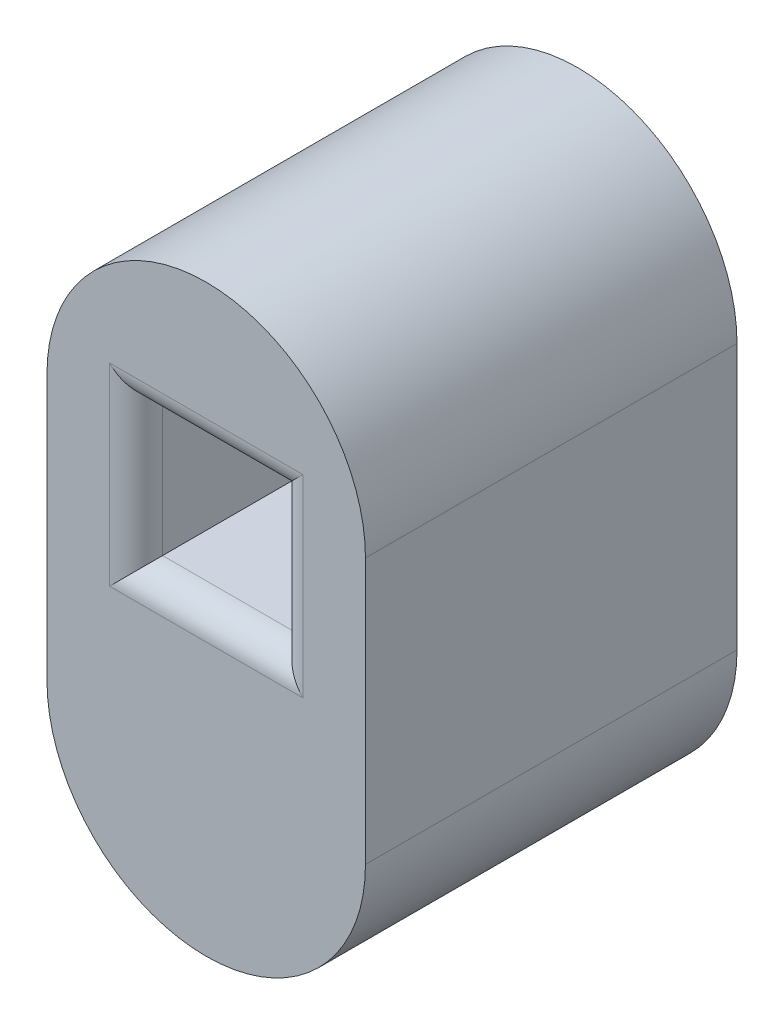
ISO-10303-21;
HEADER;
FILE_DESCRIPTION(('STEP AP214'),'2;1');
FILE_NAME('part.step','',(''),(''),'','','');
FILE_SCHEMA(('AUTOMOTIVE_DESIGN { 1 0 10303 214 1 1 1 1 }'));
ENDSEC;
DATA;
#1=APPLICATION_CONTEXT('core data for automotive mechanical design processes');
#2=APPLICATION_PROTOCOL_DEFINITION('international standard','automotive_design',2000,#1);
#3=PRODUCT_CONTEXT('',#1,'mechanical');
#4=PRODUCT('Part','Part','',(#3));
#5=PRODUCT_RELATED_PRODUCT_CATEGORY('part','',(#4));
#6=PRODUCT_DEFINITION_FORMATION('','',#4);
#7=PRODUCT_DEFINITION_CONTEXT('part definition',#1,'design');
#8=PRODUCT_DEFINITION('design','',#6,#7);
#9=PRODUCT_DEFINITION_SHAPE('','',#8);
#10=(LENGTH_UNIT() NAMED_UNIT(*) SI_UNIT(.MILLI.,.METRE.));
#11=(NAMED_UNIT(*) PLANE_ANGLE_UNIT() SI_UNIT($,.RADIAN.));
#12=(NAMED_UNIT(*) SI_UNIT($,.STERADIAN.) SOLID_ANGLE_UNIT());
#13=UNCERTAINTY_MEASURE_WITH_UNIT(LENGTH_MEASURE(1.E-05),#10,'distance_accuracy_value','');
#14=(GEOMETRIC_REPRESENTATION_CONTEXT(3) GLOBAL_UNCERTAINTY_ASSIGNED_CONTEXT((#13)) GLOBAL_UNIT_ASSIGNED_CONTEXT((#10,
#11,#12)) REPRESENTATION_CONTEXT('',''));
#15=CARTESIAN_POINT('',(0.,0.,0.));
#16=DIRECTION('',(0.,0.,1.));
#17=DIRECTION('',(1.,0.,0.));
#18=AXIS2_PLACEMENT_3D('',#15,#16,#17);
#19=CARTESIAN_POINT('',(0.,0.,14.));
#20=DIRECTION('',(0.,0.,1.));
#21=DIRECTION('',(1.,0.,0.));
#22=AXIS2_PLACEMENT_3D('',#19,#20,#21);
#23=PLANE('',#22);
#24=DIRECTION('',(0.,1.,0.));
#25=VECTOR('',#24,1.);
#26=CARTESIAN_POINT('',(3.644,0.,14.));
#27=LINE('',#26,#25);
#28=CARTESIAN_POINT('',(3.644,11.544,14.));
#29=VERTEX_POINT('',#28);
#30=CARTESIAN_POINT('',(3.644,4.256,14.));
#31=VERTEX_POINT('',#30);
#32=EDGE_CURVE('E157',#29,#31,#27,.F.);
#33=ORIENTED_EDGE('',*,*,#32,.T.);
#34=DIRECTION('',(1.,0.,0.));
#35=VECTOR('',#34,1.);
#36=CARTESIAN_POINT('',(0.,4.256,14.));
#37=LINE('',#36,#35);
#38=CARTESIAN_POINT('',(-3.644,4.256,14.));
#39=VERTEX_POINT('',#38);
#40=EDGE_CURVE('E168',#31,#39,#37,.F.);
#41=ORIENTED_EDGE('',*,*,#40,.T.);
#42=DIRECTION('',(0.,-1.,0.));
#43=VECTOR('',#42,1.);
#44=CARTESIAN_POINT('',(-3.644,0.,14.));
#45=LINE('',#44,#43);
#46=CARTESIAN_POINT('',(-3.644,11.544,14.));
#47=VERTEX_POINT('',#46);
#48=EDGE_CURVE('E166',#39,#47,#45,.F.);
#49=ORIENTED_EDGE('',*,*,#48,.T.);
#50=DIRECTION('',(-1.,0.,0.));
#51=VECTOR('',#50,1.);
#52=CARTESIAN_POINT('',(0.,11.544,14.));
#53=LINE('',#52,#51);
#54=EDGE_CURVE('E164',#47,#29,#53,.F.);
#55=ORIENTED_EDGE('',*,*,#54,.T.);
#56=EDGE_LOOP('',(#33,#41,#49,#55));
#57=FACE_BOUND('',#56,.T.);
#58=CARTESIAN_POINT('',(0.,0.,14.));
#59=DIRECTION('',(0.,0.,1.));
#60=DIRECTION('',(1.,0.,0.));
#61=AXIS2_PLACEMENT_3D('',#58,#59,#60);
#62=CIRCLE('',#61,6.);
#63=CARTESIAN_POINT('',(-6.,0.,14.));
#64=VERTEX_POINT('',#63);
#65=CARTESIAN_POINT('',(6.,0.,14.));
#66=VERTEX_POINT('',#65);
#67=EDGE_CURVE('E141',#64,#66,#62,.T.);
#68=ORIENTED_EDGE('',*,*,#67,.T.);
#69=DIRECTION('',(0.,1.,0.));
#70=VECTOR('',#69,1.);
#71=CARTESIAN_POINT('',(6.,0.,14.));
#72=LINE('',#71,#70);
#73=CARTESIAN_POINT('',(6.,10.,14.));
#74=VERTEX_POINT('',#73);
#75=EDGE_CURVE('E130',#66,#74,#72,.T.);
#76=ORIENTED_EDGE('',*,*,#75,.T.);
#77=CARTESIAN_POINT('',(0.,10.,14.));
#78=DIRECTION('',(0.,0.,1.));
#79=DIRECTION('',(1.,0.,0.));
#80=AXIS2_PLACEMENT_3D('',#77,#78,#79);
#81=CIRCLE('',#80,6.);
#82=CARTESIAN_POINT('',(-6.,10.,14.));
#83=VERTEX_POINT('',#82);
#84=EDGE_CURVE('E140',#74,#83,#81,.T.);
#85=ORIENTED_EDGE('',*,*,#84,.T.);
#86=DIRECTION('',(0.,-1.,0.));
#87=VECTOR('',#86,1.);
#88=CARTESIAN_POINT('',(-6.,0.,14.));
#89=LINE('',#88,#87);
#90=EDGE_CURVE('E145',#83,#64,#89,.T.);
#91=ORIENTED_EDGE('',*,*,#90,.T.);
#92=EDGE_LOOP('',(#68,#76,#85,#91));
#93=FACE_BOUND('',#92,.T.);
#94=ADVANCED_FACE('F39',(#57,#93),#23,.T.);
#95=CARTESIAN_POINT('',(0.,0.,0.));
#96=DIRECTION('',(0.,0.,1.));
#97=DIRECTION('',(1.,0.,0.));
#98=AXIS2_PLACEMENT_3D('',#95,#96,#97);
#99=PLANE('',#98);
#100=DIRECTION('',(-1.,0.,0.));
#101=VECTOR('',#100,1.);
#102=CARTESIAN_POINT('',(-2.644,11.544,0.));
#103=LINE('',#102,#101);
#104=CARTESIAN_POINT('',(3.644,11.544,0.));
#105=VERTEX_POINT('',#104);
#106=CARTESIAN_POINT('',(-3.644,11.544,0.));
#107=VERTEX_POINT('',#106);
#108=EDGE_CURVE('E177',#105,#107,#103,.T.);
#109=ORIENTED_EDGE('',*,*,#108,.T.);
#110=DIRECTION('',(0.,-1.,0.));
#111=VECTOR('',#110,1.);
#112=CARTESIAN_POINT('',(-3.644,5.256,0.));
#113=LINE('',#112,#111);
#114=CARTESIAN_POINT('',(-3.644,4.256,0.));
#115=VERTEX_POINT('',#114);
#116=EDGE_CURVE('E194',#107,#115,#113,.T.);
#117=ORIENTED_EDGE('',*,*,#116,.T.);
#118=DIRECTION('',(1.,0.,0.));
#119=VECTOR('',#118,1.);
#120=CARTESIAN_POINT('',(2.644,4.256,0.));
#121=LINE('',#120,#119);
#122=CARTESIAN_POINT('',(3.644,4.256,0.));
#123=VERTEX_POINT('',#122);
#124=EDGE_CURVE('E192',#115,#123,#121,.T.);
#125=ORIENTED_EDGE('',*,*,#124,.T.);
#126=DIRECTION('',(0.,1.,0.));
#127=VECTOR('',#126,1.);
#128=CARTESIAN_POINT('',(3.644,10.544,0.));
#129=LINE('',#128,#127);
#130=EDGE_CURVE('E190',#123,#105,#129,.T.);
#131=ORIENTED_EDGE('',*,*,#130,.T.);
#132=EDGE_LOOP('',(#109,#117,#125,#131));
#133=FACE_BOUND('',#132,.T.);
#134=CARTESIAN_POINT('',(0.,0.,0.));
#135=DIRECTION('',(0.,0.,1.));
#136=DIRECTION('',(1.,0.,0.));
#137=AXIS2_PLACEMENT_3D('',#134,#135,#136);
#138=CIRCLE('',#137,6.);
#139=CARTESIAN_POINT('',(-6.,0.,0.));
#140=VERTEX_POINT('',#139);
#141=CARTESIAN_POINT('',(6.,0.,0.));
#142=VERTEX_POINT('',#141);
#143=EDGE_CURVE('E153',#140,#142,#138,.T.);
#144=ORIENTED_EDGE('',*,*,#143,.F.);
#145=DIRECTION('',(0.,-1.,0.));
#146=VECTOR('',#145,1.);
#147=CARTESIAN_POINT('',(-6.,0.,0.));
#148=LINE('',#147,#146);
#149=CARTESIAN_POINT('',(-6.,10.,0.));
#150=VERTEX_POINT('',#149);
#151=EDGE_CURVE('E149',#150,#140,#148,.T.);
#152=ORIENTED_EDGE('',*,*,#151,.F.);
#153=CARTESIAN_POINT('',(0.,10.,0.));
#154=DIRECTION('',(0.,0.,1.));
#155=DIRECTION('',(1.,0.,0.));
#156=AXIS2_PLACEMENT_3D('',#153,#154,#155);
#157=CIRCLE('',#156,6.);
#158=CARTESIAN_POINT('',(6.,10.,0.));
#159=VERTEX_POINT('',#158);
#160=EDGE_CURVE('E248',#159,#150,#157,.T.);
#161=ORIENTED_EDGE('',*,*,#160,.F.);
#162=DIRECTION('',(0.,1.,0.));
#163=VECTOR('',#162,1.);
#164=CARTESIAN_POINT('',(6.,0.,0.));
#165=LINE('',#164,#163);
#166=EDGE_CURVE('E245',#142,#159,#165,.T.);
#167=ORIENTED_EDGE('',*,*,#166,.F.);
#168=EDGE_LOOP('',(#144,#152,#161,#167));
#169=FACE_BOUND('',#168,.T.);
#170=ADVANCED_FACE('F239',(#133,#169),#99,.F.);
#171=CARTESIAN_POINT('',(0.,0.,14.));
#172=DIRECTION('',(0.,0.,-1.));
#173=DIRECTION('',(-1.,0.,0.));
#174=AXIS2_PLACEMENT_3D('',#171,#172,#173);
#175=CYLINDRICAL_SURFACE('',#174,6.);
#176=ORIENTED_EDGE('',*,*,#143,.T.);
#177=DIRECTION('',(0.,0.,-1.));
#178=VECTOR('',#177,1.);
#179=CARTESIAN_POINT('',(6.,0.,14.));
#180=LINE('',#179,#178);
#181=EDGE_CURVE('E134',#66,#142,#180,.T.);
#182=ORIENTED_EDGE('',*,*,#181,.F.);
#183=ORIENTED_EDGE('',*,*,#67,.F.);
#184=DIRECTION('',(0.,0.,-1.));
#185=VECTOR('',#184,1.);
#186=CARTESIAN_POINT('',(-6.,0.,14.));
#187=LINE('',#186,#185);
#188=EDGE_CURVE('E256',#64,#140,#187,.T.);
#189=ORIENTED_EDGE('',*,*,#188,.T.);
#190=EDGE_LOOP('',(#176,#182,#183,#189));
#191=FACE_BOUND('',#190,.T.);
#192=ADVANCED_FACE('F151',(#191),#175,.T.);
#193=CARTESIAN_POINT('',(6.,0.,14.));
#194=DIRECTION('',(-1.,0.,0.));
#195=DIRECTION('',(0.,0.,1.));
#196=AXIS2_PLACEMENT_3D('',#193,#194,#195);
#197=PLANE('',#196);
#198=ORIENTED_EDGE('',*,*,#166,.T.);
#199=DIRECTION('',(0.,0.,-1.));
#200=VECTOR('',#199,1.);
#201=CARTESIAN_POINT('',(6.,10.,14.));
#202=LINE('',#201,#200);
#203=EDGE_CURVE('E137',#74,#159,#202,.T.);
#204=ORIENTED_EDGE('',*,*,#203,.F.);
#205=ORIENTED_EDGE('',*,*,#75,.F.);
#206=ORIENTED_EDGE('',*,*,#181,.T.);
#207=EDGE_LOOP('',(#198,#204,#205,#206));
#208=FACE_BOUND('',#207,.T.);
#209=ADVANCED_FACE('F132',(#208),#197,.F.);
#210=CARTESIAN_POINT('',(0.,10.,14.));
#211=DIRECTION('',(0.,0.,-1.));
#212=DIRECTION('',(-1.,0.,0.));
#213=AXIS2_PLACEMENT_3D('',#210,#211,#212);
#214=CYLINDRICAL_SURFACE('',#213,6.);
#215=ORIENTED_EDGE('',*,*,#160,.T.);
#216=DIRECTION('',(0.,0.,-1.));
#217=VECTOR('',#216,1.);
#218=CARTESIAN_POINT('',(-6.,10.,14.));
#219=LINE('',#218,#217);
#220=EDGE_CURVE('E159',#83,#150,#219,.T.);
#221=ORIENTED_EDGE('',*,*,#220,.F.);
#222=ORIENTED_EDGE('',*,*,#84,.F.);
#223=ORIENTED_EDGE('',*,*,#203,.T.);
#224=EDGE_LOOP('',(#215,#221,#222,#223));
#225=FACE_BOUND('',#224,.T.);
#226=ADVANCED_FACE('F262',(#225),#214,.T.);
#227=CARTESIAN_POINT('',(-6.,0.,14.));
#228=DIRECTION('',(1.,0.,0.));
#229=DIRECTION('',(0.,0.,-1.));
#230=AXIS2_PLACEMENT_3D('',#227,#228,#229);
#231=PLANE('',#230);
#232=ORIENTED_EDGE('',*,*,#151,.T.);
#233=ORIENTED_EDGE('',*,*,#188,.F.);
#234=ORIENTED_EDGE('',*,*,#90,.F.);
#235=ORIENTED_EDGE('',*,*,#220,.T.);
#236=EDGE_LOOP('',(#232,#233,#234,#235));
#237=FACE_BOUND('',#236,.T.);
#238=ADVANCED_FACE('F260',(#237),#231,.F.);
#239=CARTESIAN_POINT('',(2.644,5.256,14.));
#240=DIRECTION('',(-1.,0.,0.));
#241=DIRECTION('',(0.,0.,1.));
#242=AXIS2_PLACEMENT_3D('',#239,#240,#241);
#243=PLANE('',#242);
#244=DIRECTION('',(0.,0.,-1.));
#245=VECTOR('',#244,1.);
#246=CARTESIAN_POINT('',(2.644,10.544,14.));
#247=LINE('',#246,#245);
#248=CARTESIAN_POINT('',(2.644,10.544,13.));
#249=VERTEX_POINT('',#248);
#250=CARTESIAN_POINT('',(2.644,10.544,0.999999999999999));
#251=VERTEX_POINT('',#250);
#252=EDGE_CURVE('E246',#249,#251,#247,.T.);
#253=ORIENTED_EDGE('',*,*,#252,.T.);
#254=DIRECTION('',(0.,1.,0.));
#255=VECTOR('',#254,1.);
#256=CARTESIAN_POINT('',(2.644,5.256,1.));
#257=LINE('',#256,#255);
#258=CARTESIAN_POINT('',(2.644,5.256,0.999999999999999));
#259=VERTEX_POINT('',#258);
#260=EDGE_CURVE('E48',#251,#259,#257,.F.);
#261=ORIENTED_EDGE('',*,*,#260,.T.);
#262=DIRECTION('',(0.,0.,-1.));
#263=VECTOR('',#262,1.);
#264=CARTESIAN_POINT('',(2.644,5.256,14.));
#265=LINE('',#264,#263);
#266=CARTESIAN_POINT('',(2.644,5.256,13.));
#267=VERTEX_POINT('',#266);
#268=EDGE_CURVE('E188',#267,#259,#265,.T.);
#269=ORIENTED_EDGE('',*,*,#268,.F.);
#270=DIRECTION('',(0.,1.,0.));
#271=VECTOR('',#270,1.);
#272=CARTESIAN_POINT('',(2.644,5.256,13.));
#273=LINE('',#272,#271);
#274=EDGE_CURVE('E175',#267,#249,#273,.T.);
#275=ORIENTED_EDGE('',*,*,#274,.T.);
#276=EDGE_LOOP('',(#253,#261,#269,#275));
#277=FACE_BOUND('',#276,.T.);
#278=ADVANCED_FACE('F281',(#277),#243,.T.);
#279=CARTESIAN_POINT('',(-2.644,10.544,14.));
#280=DIRECTION('',(0.,-1.,0.));
#281=DIRECTION('',(0.,0.,-1.));
#282=AXIS2_PLACEMENT_3D('',#279,#280,#281);
#283=PLANE('',#282);
#284=DIRECTION('',(0.,0.,-1.));
#285=VECTOR('',#284,1.);
#286=CARTESIAN_POINT('',(-2.644,10.544,14.));
#287=LINE('',#286,#285);
#288=CARTESIAN_POINT('',(-2.644,10.544,13.));
#289=VERTEX_POINT('',#288);
#290=CARTESIAN_POINT('',(-2.644,10.544,0.999999999999999));
#291=VERTEX_POINT('',#290);
#292=EDGE_CURVE('E233',#289,#291,#287,.T.);
#293=ORIENTED_EDGE('',*,*,#292,.T.);
#294=DIRECTION('',(-1.,0.,0.));
#295=VECTOR('',#294,1.);
#296=CARTESIAN_POINT('',(2.644,10.544,1.));
#297=LINE('',#296,#295);
#298=EDGE_CURVE('E11',#291,#251,#297,.F.);
#299=ORIENTED_EDGE('',*,*,#298,.T.);
#300=ORIENTED_EDGE('',*,*,#252,.F.);
#301=DIRECTION('',(-1.,0.,0.));
#302=VECTOR('',#301,1.);
#303=CARTESIAN_POINT('',(-2.644,10.544,13.));
#304=LINE('',#303,#302);
#305=EDGE_CURVE('E173',#249,#289,#304,.T.);
#306=ORIENTED_EDGE('',*,*,#305,.T.);
#307=EDGE_LOOP('',(#293,#299,#300,#306));
#308=FACE_BOUND('',#307,.T.);
#309=ADVANCED_FACE('F265',(#308),#283,.T.);
#310=CARTESIAN_POINT('',(-2.644,5.256,14.));
#311=DIRECTION('',(1.,0.,0.));
#312=DIRECTION('',(0.,0.,-1.));
#313=AXIS2_PLACEMENT_3D('',#310,#311,#312);
#314=PLANE('',#313);
#315=DIRECTION('',(0.,0.,-1.));
#316=VECTOR('',#315,1.);
#317=CARTESIAN_POINT('',(-2.644,5.256,14.));
#318=LINE('',#317,#316);
#319=CARTESIAN_POINT('',(-2.644,5.256,13.));
#320=VERTEX_POINT('',#319);
#321=CARTESIAN_POINT('',(-2.644,5.256,0.999999999999999));
#322=VERTEX_POINT('',#321);
#323=EDGE_CURVE('E226',#320,#322,#318,.T.);
#324=ORIENTED_EDGE('',*,*,#323,.T.);
#325=DIRECTION('',(0.,-1.,0.));
#326=VECTOR('',#325,1.);
#327=CARTESIAN_POINT('',(-2.644,10.544,1.));
#328=LINE('',#327,#326);
#329=EDGE_CURVE('E197',#322,#291,#328,.F.);
#330=ORIENTED_EDGE('',*,*,#329,.T.);
#331=ORIENTED_EDGE('',*,*,#292,.F.);
#332=DIRECTION('',(0.,-1.,0.));
#333=VECTOR('',#332,1.);
#334=CARTESIAN_POINT('',(-2.644,5.256,13.));
#335=LINE('',#334,#333);
#336=EDGE_CURVE('E171',#289,#320,#335,.T.);
#337=ORIENTED_EDGE('',*,*,#336,.T.);
#338=EDGE_LOOP('',(#324,#330,#331,#337));
#339=FACE_BOUND('',#338,.T.);
#340=ADVANCED_FACE('F230',(#339),#314,.T.);
#341=CARTESIAN_POINT('',(-2.644,5.256,14.));
#342=DIRECTION('',(0.,1.,0.));
#343=DIRECTION('',(0.,0.,1.));
#344=AXIS2_PLACEMENT_3D('',#341,#342,#343);
#345=PLANE('',#344);
#346=ORIENTED_EDGE('',*,*,#268,.T.);
#347=DIRECTION('',(1.,0.,0.));
#348=VECTOR('',#347,1.);
#349=CARTESIAN_POINT('',(-2.644,5.256,1.));
#350=LINE('',#349,#348);
#351=EDGE_CURVE('E200',#259,#322,#350,.F.);
#352=ORIENTED_EDGE('',*,*,#351,.T.);
#353=ORIENTED_EDGE('',*,*,#323,.F.);
#354=DIRECTION('',(1.,0.,0.));
#355=VECTOR('',#354,1.);
#356=CARTESIAN_POINT('',(-2.644,5.256,13.));
#357=LINE('',#356,#355);
#358=EDGE_CURVE('E154',#320,#267,#357,.T.);
#359=ORIENTED_EDGE('',*,*,#358,.T.);
#360=EDGE_LOOP('',(#346,#352,#353,#359));
#361=FACE_BOUND('',#360,.T.);
#362=ADVANCED_FACE('F225',(#361),#345,.T.);
#363=CARTESIAN_POINT('',(-2.644,11.544,13.));
#364=DIRECTION('',(-1.,0.,0.));
#365=DIRECTION('',(0.,0.,1.));
#366=AXIS2_PLACEMENT_3D('',#363,#364,#365);
#367=CYLINDRICAL_SURFACE('',#366,1.);
#368=CARTESIAN_POINT('',(3.644,11.544,13.));
#369=DIRECTION('',(-0.707106781186547,0.707106781186547,0.));
#370=DIRECTION('',(-0.707106781186547,-0.707106781186547,0.));
#371=AXIS2_PLACEMENT_3D('',#368,#369,#370);
#372=ELLIPSE('',#371,1.41421356237309,1.);
#373=EDGE_CURVE('E182',#29,#249,#372,.F.);
#374=ORIENTED_EDGE('',*,*,#373,.F.);
#375=ORIENTED_EDGE('',*,*,#54,.F.);
#376=CARTESIAN_POINT('',(-3.644,11.544,13.));
#377=DIRECTION('',(-0.707106781186547,-0.707106781186547,0.));
#378=DIRECTION('',(0.707106781186547,-0.707106781186547,0.));
#379=AXIS2_PLACEMENT_3D('',#376,#377,#378);
#380=ELLIPSE('',#379,1.41421356237309,1.);
#381=EDGE_CURVE('E185',#289,#47,#380,.T.);
#382=ORIENTED_EDGE('',*,*,#381,.F.);
#383=ORIENTED_EDGE('',*,*,#305,.F.);
#384=EDGE_LOOP('',(#374,#375,#382,#383));
#385=FACE_BOUND('',#384,.T.);
#386=ADVANCED_FACE('F271',(#385),#367,.T.);
#387=CARTESIAN_POINT('',(-3.644,5.256,13.));
#388=DIRECTION('',(0.,-1.,0.));
#389=DIRECTION('',(0.,0.,-1.));
#390=AXIS2_PLACEMENT_3D('',#387,#388,#389);
#391=CYLINDRICAL_SURFACE('',#390,1.);
#392=ORIENTED_EDGE('',*,*,#381,.T.);
#393=ORIENTED_EDGE('',*,*,#48,.F.);
#394=CARTESIAN_POINT('',(-3.644,4.256,13.));
#395=DIRECTION('',(0.707106781186547,-0.707106781186547,0.));
#396=DIRECTION('',(0.707106781186547,0.707106781186547,0.));
#397=AXIS2_PLACEMENT_3D('',#394,#395,#396);
#398=ELLIPSE('',#397,1.41421356237309,1.);
#399=EDGE_CURVE('E180',#320,#39,#398,.T.);
#400=ORIENTED_EDGE('',*,*,#399,.F.);
#401=ORIENTED_EDGE('',*,*,#336,.F.);
#402=EDGE_LOOP('',(#392,#393,#400,#401));
#403=FACE_BOUND('',#402,.T.);
#404=ADVANCED_FACE('F274',(#403),#391,.T.);
#405=CARTESIAN_POINT('',(3.644,5.256,13.));
#406=DIRECTION('',(0.,1.,0.));
#407=DIRECTION('',(0.,0.,1.));
#408=AXIS2_PLACEMENT_3D('',#405,#406,#407);
#409=CYLINDRICAL_SURFACE('',#408,1.);
#410=ORIENTED_EDGE('',*,*,#373,.T.);
#411=ORIENTED_EDGE('',*,*,#274,.F.);
#412=CARTESIAN_POINT('',(3.644,4.256,13.));
#413=DIRECTION('',(0.707106781186547,0.707106781186547,0.));
#414=DIRECTION('',(0.707106781186547,-0.707106781186547,0.));
#415=AXIS2_PLACEMENT_3D('',#412,#413,#414);
#416=ELLIPSE('',#415,1.41421356237309,1.);
#417=EDGE_CURVE('E178',#31,#267,#416,.F.);
#418=ORIENTED_EDGE('',*,*,#417,.F.);
#419=ORIENTED_EDGE('',*,*,#32,.F.);
#420=EDGE_LOOP('',(#410,#411,#418,#419));
#421=FACE_BOUND('',#420,.T.);
#422=ADVANCED_FACE('F283',(#421),#409,.T.);
#423=CARTESIAN_POINT('',(-2.644,4.256,13.));
#424=DIRECTION('',(1.,0.,0.));
#425=DIRECTION('',(0.,0.,-1.));
#426=AXIS2_PLACEMENT_3D('',#423,#424,#425);
#427=CYLINDRICAL_SURFACE('',#426,1.);
#428=ORIENTED_EDGE('',*,*,#399,.T.);
#429=ORIENTED_EDGE('',*,*,#40,.F.);
#430=ORIENTED_EDGE('',*,*,#417,.T.);
#431=ORIENTED_EDGE('',*,*,#358,.F.);
#432=EDGE_LOOP('',(#428,#429,#430,#431));
#433=FACE_BOUND('',#432,.T.);
#434=ADVANCED_FACE('F278',(#433),#427,.T.);
#435=CARTESIAN_POINT('',(3.644,0.,1.));
#436=DIRECTION('',(0.,-1.,0.));
#437=DIRECTION('',(0.,0.,-1.));
#438=AXIS2_PLACEMENT_3D('',#435,#436,#437);
#439=CYLINDRICAL_SURFACE('',#438,1.);
#440=CARTESIAN_POINT('',(3.644,4.256,1.));
#441=DIRECTION('',(-0.707106781186547,-0.707106781186547,0.));
#442=DIRECTION('',(-0.707106781186547,0.707106781186547,0.));
#443=AXIS2_PLACEMENT_3D('',#440,#441,#442);
#444=ELLIPSE('',#443,1.41421356237309,1.);
#445=EDGE_CURVE('E206',#259,#123,#444,.T.);
#446=ORIENTED_EDGE('',*,*,#445,.F.);
#447=ORIENTED_EDGE('',*,*,#260,.F.);
#448=CARTESIAN_POINT('',(3.644,11.544,1.));
#449=DIRECTION('',(0.707106781186547,-0.707106781186547,0.));
#450=DIRECTION('',(-0.707106781186547,-0.707106781186547,0.));
#451=AXIS2_PLACEMENT_3D('',#448,#449,#450);
#452=ELLIPSE('',#451,1.41421356237309,1.);
#453=EDGE_CURVE('E43',#105,#251,#452,.F.);
#454=ORIENTED_EDGE('',*,*,#453,.F.);
#455=ORIENTED_EDGE('',*,*,#130,.F.);
#456=EDGE_LOOP('',(#446,#447,#454,#455));
#457=FACE_BOUND('',#456,.T.);
#458=ADVANCED_FACE('F41',(#457),#439,.T.);
#459=CARTESIAN_POINT('',(0.,11.544,1.));
#460=DIRECTION('',(1.,0.,0.));
#461=DIRECTION('',(0.,0.,-1.));
#462=AXIS2_PLACEMENT_3D('',#459,#460,#461);
#463=CYLINDRICAL_SURFACE('',#462,1.);
#464=ORIENTED_EDGE('',*,*,#453,.T.);
#465=ORIENTED_EDGE('',*,*,#298,.F.);
#466=CARTESIAN_POINT('',(-3.644,11.544,1.));
#467=DIRECTION('',(0.707106781186547,0.707106781186547,0.));
#468=DIRECTION('',(-0.707106781186547,0.707106781186547,0.));
#469=AXIS2_PLACEMENT_3D('',#466,#467,#468);
#470=ELLIPSE('',#469,1.41421356237309,1.);
#471=EDGE_CURVE('E205',#107,#291,#470,.F.);
#472=ORIENTED_EDGE('',*,*,#471,.F.);
#473=ORIENTED_EDGE('',*,*,#108,.F.);
#474=EDGE_LOOP('',(#464,#465,#472,#473));
#475=FACE_BOUND('',#474,.T.);
#476=ADVANCED_FACE('F216',(#475),#463,.T.);
#477=CARTESIAN_POINT('',(0.,4.256,1.));
#478=DIRECTION('',(-1.,0.,0.));
#479=DIRECTION('',(0.,0.,1.));
#480=AXIS2_PLACEMENT_3D('',#477,#478,#479);
#481=CYLINDRICAL_SURFACE('',#480,1.);
#482=ORIENTED_EDGE('',*,*,#445,.T.);
#483=ORIENTED_EDGE('',*,*,#124,.F.);
#484=CARTESIAN_POINT('',(-3.644,4.256,1.));
#485=DIRECTION('',(-0.707106781186547,0.707106781186547,0.));
#486=DIRECTION('',(0.707106781186547,0.707106781186547,0.));
#487=AXIS2_PLACEMENT_3D('',#484,#485,#486);
#488=ELLIPSE('',#487,1.41421356237309,1.);
#489=EDGE_CURVE('E203',#322,#115,#488,.T.);
#490=ORIENTED_EDGE('',*,*,#489,.F.);
#491=ORIENTED_EDGE('',*,*,#351,.F.);
#492=EDGE_LOOP('',(#482,#483,#490,#491));
#493=FACE_BOUND('',#492,.T.);
#494=ADVANCED_FACE('F221',(#493),#481,.T.);
#495=CARTESIAN_POINT('',(-3.644,0.,1.));
#496=DIRECTION('',(0.,1.,0.));
#497=DIRECTION('',(0.,0.,1.));
#498=AXIS2_PLACEMENT_3D('',#495,#496,#497);
#499=CYLINDRICAL_SURFACE('',#498,1.);
#500=ORIENTED_EDGE('',*,*,#471,.T.);
#501=ORIENTED_EDGE('',*,*,#329,.F.);
#502=ORIENTED_EDGE('',*,*,#489,.T.);
#503=ORIENTED_EDGE('',*,*,#116,.F.);
#504=EDGE_LOOP('',(#500,#501,#502,#503));
#505=FACE_BOUND('',#504,.T.);
#506=ADVANCED_FACE('F236',(#505),#499,.T.);
#507=CLOSED_SHELL('',(#94,#170,#192,#209,#226,#238,#278,#309,#340,#362,#386,#404,#422,#434,#458,
#476,#494,#506));
#508=MANIFOLD_SOLID_BREP('B2',#507);
#509=ADVANCED_BREP_SHAPE_REPRESENTATION('',(#18,#508),#14);
#510=SHAPE_DEFINITION_REPRESENTATION(#9,#509);
ENDSEC;
END-ISO-10303-21;
